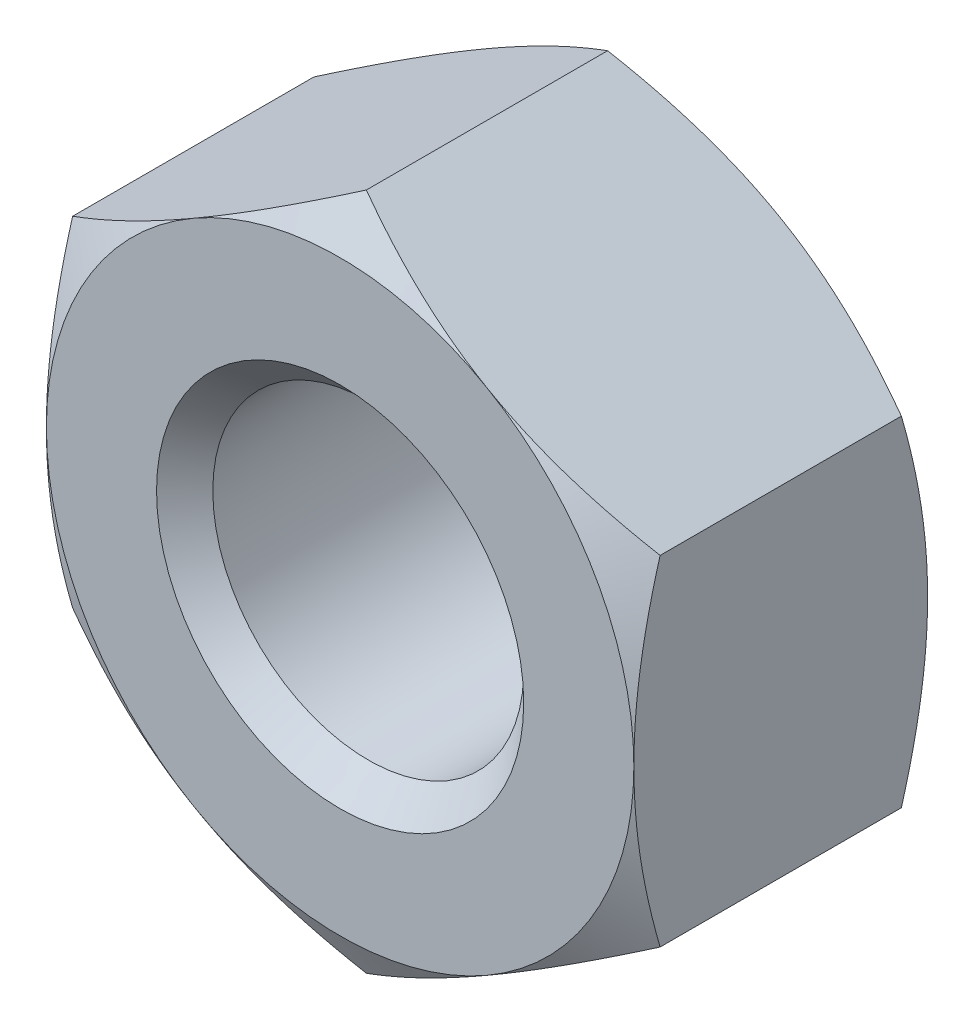
ISO-10303-21;
HEADER;
FILE_DESCRIPTION(('STEP AP214'),'2;1');
FILE_NAME('part.step','',(''),(''),'','','');
FILE_SCHEMA(('AUTOMOTIVE_DESIGN { 1 0 10303 214 1 1 1 1 }'));
ENDSEC;
DATA;
#1=APPLICATION_CONTEXT('core data for automotive mechanical design processes');
#2=APPLICATION_PROTOCOL_DEFINITION('international standard','automotive_design',2000,#1);
#3=PRODUCT_CONTEXT('',#1,'mechanical');
#4=PRODUCT('Part','Part','',(#3));
#5=PRODUCT_RELATED_PRODUCT_CATEGORY('part','',(#4));
#6=PRODUCT_DEFINITION_FORMATION('','',#4);
#7=PRODUCT_DEFINITION_CONTEXT('part definition',#1,'design');
#8=PRODUCT_DEFINITION('design','',#6,#7);
#9=PRODUCT_DEFINITION_SHAPE('','',#8);
#10=(LENGTH_UNIT() NAMED_UNIT(*) SI_UNIT(.MILLI.,.METRE.));
#11=(NAMED_UNIT(*) PLANE_ANGLE_UNIT() SI_UNIT($,.RADIAN.));
#12=(NAMED_UNIT(*) SI_UNIT($,.STERADIAN.) SOLID_ANGLE_UNIT());
#13=UNCERTAINTY_MEASURE_WITH_UNIT(LENGTH_MEASURE(1.E-05),#10,'distance_accuracy_value','');
#14=(GEOMETRIC_REPRESENTATION_CONTEXT(3) GLOBAL_UNCERTAINTY_ASSIGNED_CONTEXT((#13)) GLOBAL_UNIT_ASSIGNED_CONTEXT((#10,
#11,#12)) REPRESENTATION_CONTEXT('',''));
#15=CARTESIAN_POINT('',(0.,0.,0.));
#16=DIRECTION('',(0.,0.,1.));
#17=DIRECTION('',(1.,0.,0.));
#18=AXIS2_PLACEMENT_3D('',#15,#16,#17);
#19=CARTESIAN_POINT('',(0.,0.,-2.));
#20=DIRECTION('',(0.,0.,1.));
#21=DIRECTION('',(1.,0.,0.));
#22=AXIS2_PLACEMENT_3D('',#19,#20,#21);
#23=CONICAL_SURFACE('',#22,4.,1.0471975511966);
#24=CARTESIAN_POINT('',(0.,0.,-2.));
#25=DIRECTION('',(0.,0.,-1.));
#26=DIRECTION('',(1.,0.,0.));
#27=AXIS2_PLACEMENT_3D('',#24,#25,#26);
#28=CIRCLE('',#27,4.);
#29=CARTESIAN_POINT('',(4.,0.,-2.));
#30=VERTEX_POINT('',#29);
#31=CARTESIAN_POINT('',(2.,-3.46410161513775,-2.));
#32=VERTEX_POINT('',#31);
#33=EDGE_CURVE('E199',#30,#32,#28,.T.);
#34=ORIENTED_EDGE('',*,*,#33,.F.);
#35=CARTESIAN_POINT('',(4.,-2.30940107679301,-1.64273441008188));
#36=CARTESIAN_POINT('',(4.,-1.07179676973836,-2.));
#37=CARTESIAN_POINT('',(4.,0.,-2.));
#38=(BOUNDED_CURVE() B_SPLINE_CURVE(2,(#35,#36,#37),.UNSPECIFIED.,.F.,
.F.) B_SPLINE_CURVE_WITH_KNOTS((3,3),(-1.78462536994746,-1.30108428744166),
.UNSPECIFIED.) CURVE() GEOMETRIC_REPRESENTATION_ITEM() RATIONAL_B_SPLINE_CURVE((1.93301270188836,
2.08253175473056,2.08253175473056)) REPRESENTATION_ITEM(''));
#39=CARTESIAN_POINT('',(4.,-2.30940107675905,-1.64273441009221));
#40=VERTEX_POINT('',#39);
#41=EDGE_CURVE('E339',#40,#30,#38,.T.);
#42=ORIENTED_EDGE('',*,*,#41,.F.);
#43=CARTESIAN_POINT('',(2.,-3.46410161513775,-2.));
#44=CARTESIAN_POINT('',(2.92820323028725,-2.92820323026873,-2.));
#45=CARTESIAN_POINT('',(4.00000000002922,-2.30940107674163,-1.6427344100821));
#46=(BOUNDED_CURVE() B_SPLINE_CURVE(2,(#43,#44,#45),.UNSPECIFIED.,.F.,
.F.) B_SPLINE_CURVE_WITH_KNOTS((3,3),(-1.30108428744166,-0.817543204935995),
.UNSPECIFIED.) CURVE() GEOMETRIC_REPRESENTATION_ITEM() RATIONAL_B_SPLINE_CURVE((2.08253175473055,
2.08253175473056,1.93301270188844)) REPRESENTATION_ITEM(''));
#47=EDGE_CURVE('E159',#32,#40,#46,.T.);
#48=ORIENTED_EDGE('',*,*,#47,.F.);
#49=EDGE_LOOP('',(#34,#42,#48));
#50=FACE_BOUND('',#49,.T.);
#51=ADVANCED_FACE('F17',(#50),#23,.T.);
#52=CARTESIAN_POINT('',(0.,0.,-2.));
#53=DIRECTION('',(0.,0.,1.));
#54=DIRECTION('',(1.,0.,0.));
#55=AXIS2_PLACEMENT_3D('',#52,#53,#54);
#56=CONICAL_SURFACE('',#55,4.,1.0471975511966);
#57=CARTESIAN_POINT('',(0.,0.,-2.));
#58=DIRECTION('',(0.,0.,-1.));
#59=DIRECTION('',(1.,0.,0.));
#60=AXIS2_PLACEMENT_3D('',#57,#58,#59);
#61=CIRCLE('',#60,4.);
#62=CARTESIAN_POINT('',(-2.,-3.46410161513776,-2.));
#63=VERTEX_POINT('',#62);
#64=EDGE_CURVE('E154',#32,#63,#61,.T.);
#65=ORIENTED_EDGE('',*,*,#64,.F.);
#66=CARTESIAN_POINT('',(-2.95281200039479E-11,-4.61880215353405,-1.642734410082));
#67=CARTESIAN_POINT('',(1.07179676971262,-4.00000000000685,-2.));
#68=CARTESIAN_POINT('',(2.,-3.46410161513775,-2.));
#69=(BOUNDED_CURVE() B_SPLINE_CURVE(2,(#66,#67,#68),.UNSPECIFIED.,.F.,
.F.) B_SPLINE_CURVE_WITH_KNOTS((3,3),(-1.78462536994739,-1.30108428744166),
.UNSPECIFIED.) CURVE() GEOMETRIC_REPRESENTATION_ITEM() RATIONAL_B_SPLINE_CURVE((1.9330127018884,
2.08253175473055,2.08253175473055)) REPRESENTATION_ITEM(''));
#70=CARTESIAN_POINT('',(0.,-4.61880215351701,-1.64273441009184));
#71=VERTEX_POINT('',#70);
#72=EDGE_CURVE('E147',#71,#32,#69,.T.);
#73=ORIENTED_EDGE('',*,*,#72,.F.);
#74=CARTESIAN_POINT('',(-1.99999999999999,-3.46410161513776,-2.));
#75=CARTESIAN_POINT('',(-1.07179676971262,-4.00000000000685,-2.));
#76=CARTESIAN_POINT('',(2.95292687010294E-11,-4.61880215353405,-1.642734410082));
#77=(BOUNDED_CURVE() B_SPLINE_CURVE(2,(#74,#75,#76),.UNSPECIFIED.,.F.,
.F.) B_SPLINE_CURVE_WITH_KNOTS((3,3),(-1.30108428744166,-0.81754320493593),
.UNSPECIFIED.) CURVE() GEOMETRIC_REPRESENTATION_ITEM() RATIONAL_B_SPLINE_CURVE((2.08253175473056,
2.08253175473056,1.9330127018884)) REPRESENTATION_ITEM(''));
#78=EDGE_CURVE('E151',#63,#71,#77,.T.);
#79=ORIENTED_EDGE('',*,*,#78,.F.);
#80=EDGE_LOOP('',(#65,#73,#79));
#81=FACE_BOUND('',#80,.T.);
#82=ADVANCED_FACE('F149',(#81),#56,.T.);
#83=CARTESIAN_POINT('',(0.,0.,-2.));
#84=DIRECTION('',(0.,0.,1.));
#85=DIRECTION('',(1.,0.,0.));
#86=AXIS2_PLACEMENT_3D('',#83,#84,#85);
#87=CONICAL_SURFACE('',#86,4.,1.0471975511966);
#88=CARTESIAN_POINT('',(0.,0.,-2.));
#89=DIRECTION('',(0.,0.,-1.));
#90=DIRECTION('',(1.,0.,0.));
#91=AXIS2_PLACEMENT_3D('',#88,#89,#90);
#92=CIRCLE('',#91,4.);
#93=CARTESIAN_POINT('',(-4.,0.,-2.));
#94=VERTEX_POINT('',#93);
#95=EDGE_CURVE('E222',#63,#94,#92,.T.);
#96=ORIENTED_EDGE('',*,*,#95,.F.);
#97=CARTESIAN_POINT('',(-4.00000000002953,-2.30940107674145,-1.642734410082));
#98=CARTESIAN_POINT('',(-2.92820323028737,-2.92820323026866,-2.));
#99=CARTESIAN_POINT('',(-1.99999999999999,-3.46410161513776,-2.));
#100=(BOUNDED_CURVE() B_SPLINE_CURVE(2,(#97,#98,#99),.UNSPECIFIED.,.F.,
.F.) B_SPLINE_CURVE_WITH_KNOTS((3,3),(-1.78462536994738,-1.30108428744166),
.UNSPECIFIED.) CURVE() GEOMETRIC_REPRESENTATION_ITEM() RATIONAL_B_SPLINE_CURVE((1.9330127018884,
2.08253175473056,2.08253175473056)) REPRESENTATION_ITEM(''));
#101=CARTESIAN_POINT('',(-4.,-2.3094010767585,-1.64273441009184));
#102=VERTEX_POINT('',#101);
#103=EDGE_CURVE('E174',#102,#63,#100,.T.);
#104=ORIENTED_EDGE('',*,*,#103,.F.);
#105=CARTESIAN_POINT('',(-4.,0.,-2.));
#106=CARTESIAN_POINT('',(-4.,-1.07179676973819,-2.));
#107=CARTESIAN_POINT('',(-4.,-2.3094010767926,-1.642734410082));
#108=(BOUNDED_CURVE() B_SPLINE_CURVE(2,(#105,#106,#107),.UNSPECIFIED.,.F.,
.F.) B_SPLINE_CURVE_WITH_KNOTS((3,3),(-1.30108428744166,-0.81754320493593),
.UNSPECIFIED.) CURVE() GEOMETRIC_REPRESENTATION_ITEM() RATIONAL_B_SPLINE_CURVE((2.08253175473055,
2.08253175473055,1.9330127018884)) REPRESENTATION_ITEM(''));
#109=EDGE_CURVE('E303',#94,#102,#108,.T.);
#110=ORIENTED_EDGE('',*,*,#109,.F.);
#111=EDGE_LOOP('',(#96,#104,#110));
#112=FACE_BOUND('',#111,.T.);
#113=ADVANCED_FACE('F545',(#112),#87,.T.);
#114=CARTESIAN_POINT('',(0.,0.,-2.));
#115=DIRECTION('',(0.,0.,1.));
#116=DIRECTION('',(1.,0.,0.));
#117=AXIS2_PLACEMENT_3D('',#114,#115,#116);
#118=CONICAL_SURFACE('',#117,4.,1.0471975511966);
#119=CARTESIAN_POINT('',(0.,0.,-2.));
#120=DIRECTION('',(0.,0.,-1.));
#121=DIRECTION('',(1.,0.,0.));
#122=AXIS2_PLACEMENT_3D('',#119,#120,#121);
#123=CIRCLE('',#122,4.);
#124=CARTESIAN_POINT('',(-2.,3.46410161513775,-2.));
#125=VERTEX_POINT('',#124);
#126=EDGE_CURVE('E215',#94,#125,#123,.T.);
#127=ORIENTED_EDGE('',*,*,#126,.F.);
#128=CARTESIAN_POINT('',(-4.,2.30940107679259,-1.642734410082));
#129=CARTESIAN_POINT('',(-4.,1.07179676973819,-2.));
#130=CARTESIAN_POINT('',(-4.,0.,-2.));
#131=(BOUNDED_CURVE() B_SPLINE_CURVE(2,(#128,#129,#130),.UNSPECIFIED.,.F.,
.F.) B_SPLINE_CURVE_WITH_KNOTS((3,3),(-1.78462536994738,-1.30108428744166),
.UNSPECIFIED.) CURVE() GEOMETRIC_REPRESENTATION_ITEM() RATIONAL_B_SPLINE_CURVE((1.9330127018884,
2.08253175473055,2.08253175473055)) REPRESENTATION_ITEM(''));
#132=CARTESIAN_POINT('',(-4.,2.3094010767585,-1.64273441009184));
#133=VERTEX_POINT('',#132);
#134=EDGE_CURVE('E310',#133,#94,#131,.T.);
#135=ORIENTED_EDGE('',*,*,#134,.F.);
#136=CARTESIAN_POINT('',(-2.,3.46410161513775,-2.));
#137=CARTESIAN_POINT('',(-2.92820323028738,2.92820323026866,-2.));
#138=CARTESIAN_POINT('',(-4.00000000002952,2.30940107674146,-1.642734410082));
#139=(BOUNDED_CURVE() B_SPLINE_CURVE(2,(#136,#137,#138),.UNSPECIFIED.,.F.,
.F.) B_SPLINE_CURVE_WITH_KNOTS((3,3),(-1.30108428744166,-0.817543204935931),
.UNSPECIFIED.) CURVE() GEOMETRIC_REPRESENTATION_ITEM() RATIONAL_B_SPLINE_CURVE((2.08253175473055,
2.08253175473055,1.9330127018884)) REPRESENTATION_ITEM(''));
#140=EDGE_CURVE('E229',#125,#133,#139,.T.);
#141=ORIENTED_EDGE('',*,*,#140,.F.);
#142=EDGE_LOOP('',(#127,#135,#141));
#143=FACE_BOUND('',#142,.T.);
#144=ADVANCED_FACE('F486',(#143),#118,.T.);
#145=CARTESIAN_POINT('',(0.,0.,-2.));
#146=DIRECTION('',(0.,0.,1.));
#147=DIRECTION('',(1.,0.,0.));
#148=AXIS2_PLACEMENT_3D('',#145,#146,#147);
#149=CONICAL_SURFACE('',#148,4.,1.0471975511966);
#150=CARTESIAN_POINT('',(2.,3.46410161513775,-2.));
#151=CARTESIAN_POINT('',(1.07179676971262,4.00000000000685,-2.));
#152=CARTESIAN_POINT('',(-2.95240995641624E-11,4.61880215353405,-1.642734410082));
#153=(BOUNDED_CURVE() B_SPLINE_CURVE(2,(#150,#151,#152),.UNSPECIFIED.,.F.,
.F.) B_SPLINE_CURVE_WITH_KNOTS((3,3),(-1.30108428744166,-0.817543204935931),
.UNSPECIFIED.) CURVE() GEOMETRIC_REPRESENTATION_ITEM() RATIONAL_B_SPLINE_CURVE((2.08253175473056,
2.08253175473056,1.9330127018884)) REPRESENTATION_ITEM(''));
#154=CARTESIAN_POINT('',(2.,3.46410161513776,-2.));
#155=VERTEX_POINT('',#154);
#156=CARTESIAN_POINT('',(0.,4.61880215351701,-1.64273441009184));
#157=VERTEX_POINT('',#156);
#158=EDGE_CURVE('E266',#155,#157,#153,.T.);
#159=ORIENTED_EDGE('',*,*,#158,.F.);
#160=CARTESIAN_POINT('',(0.,0.,-2.));
#161=DIRECTION('',(0.,0.,-1.));
#162=DIRECTION('',(1.,0.,0.));
#163=AXIS2_PLACEMENT_3D('',#160,#161,#162);
#164=CIRCLE('',#163,4.);
#165=EDGE_CURVE('E200',#125,#155,#164,.T.);
#166=ORIENTED_EDGE('',*,*,#165,.F.);
#167=CARTESIAN_POINT('',(2.95212278214586E-11,4.61880215353405,-1.642734410082));
#168=CARTESIAN_POINT('',(-1.07179676971263,4.00000000000685,-2.));
#169=CARTESIAN_POINT('',(-2.,3.46410161513775,-2.));
#170=(BOUNDED_CURVE() B_SPLINE_CURVE(2,(#167,#168,#169),.UNSPECIFIED.,.F.,
.F.) B_SPLINE_CURVE_WITH_KNOTS((3,3),(-1.78462536994738,-1.30108428744166),
.UNSPECIFIED.) CURVE() GEOMETRIC_REPRESENTATION_ITEM() RATIONAL_B_SPLINE_CURVE((1.9330127018884,
2.08253175473055,2.08253175473055)) REPRESENTATION_ITEM(''));
#171=EDGE_CURVE('E235',#157,#125,#170,.T.);
#172=ORIENTED_EDGE('',*,*,#171,.F.);
#173=EDGE_LOOP('',(#159,#166,#172));
#174=FACE_BOUND('',#173,.T.);
#175=ADVANCED_FACE('F479',(#174),#149,.T.);
#176=CARTESIAN_POINT('',(0.,0.,-2.));
#177=DIRECTION('',(0.,0.,1.));
#178=DIRECTION('',(1.,0.,0.));
#179=AXIS2_PLACEMENT_3D('',#176,#177,#178);
#180=CONICAL_SURFACE('',#179,4.,1.0471975511966);
#181=CARTESIAN_POINT('',(0.,0.,-2.));
#182=DIRECTION('',(0.,0.,1.));
#183=DIRECTION('',(1.,0.,0.));
#184=AXIS2_PLACEMENT_3D('',#181,#182,#183);
#185=CIRCLE('',#184,4.);
#186=EDGE_CURVE('E192',#30,#155,#185,.T.);
#187=ORIENTED_EDGE('',*,*,#186,.T.);
#188=CARTESIAN_POINT('',(4.00000000002952,2.30940107674146,-1.642734410082));
#189=CARTESIAN_POINT('',(2.92820323028738,2.92820323026866,-2.));
#190=CARTESIAN_POINT('',(2.,3.46410161513775,-2.));
#191=(BOUNDED_CURVE() B_SPLINE_CURVE(2,(#188,#189,#190),.UNSPECIFIED.,.F.,
.F.) B_SPLINE_CURVE_WITH_KNOTS((3,3),(-1.78462536994738,-1.30108428744166),
.UNSPECIFIED.) CURVE() GEOMETRIC_REPRESENTATION_ITEM() RATIONAL_B_SPLINE_CURVE((1.9330127018884,
2.08253175473056,2.08253175473056)) REPRESENTATION_ITEM(''));
#192=CARTESIAN_POINT('',(4.,2.3094010767585,-1.64273441009184));
#193=VERTEX_POINT('',#192);
#194=EDGE_CURVE('E188',#193,#155,#191,.T.);
#195=ORIENTED_EDGE('',*,*,#194,.F.);
#196=CARTESIAN_POINT('',(4.,0.,-2.));
#197=CARTESIAN_POINT('',(4.,1.07179676973819,-2.));
#198=CARTESIAN_POINT('',(4.,2.3094010767926,-1.642734410082));
#199=(BOUNDED_CURVE() B_SPLINE_CURVE(2,(#196,#197,#198),.UNSPECIFIED.,.F.,
.F.) B_SPLINE_CURVE_WITH_KNOTS((3,3),(-1.30108428744166,-0.817543204935931),
.UNSPECIFIED.) CURVE() GEOMETRIC_REPRESENTATION_ITEM() RATIONAL_B_SPLINE_CURVE((2.08253175473056,
2.08253175473056,1.9330127018884)) REPRESENTATION_ITEM(''));
#200=EDGE_CURVE('E368',#30,#193,#199,.T.);
#201=ORIENTED_EDGE('',*,*,#200,.F.);
#202=EDGE_LOOP('',(#187,#195,#201));
#203=FACE_BOUND('',#202,.T.);
#204=ADVANCED_FACE('F560',(#203),#180,.T.);
#205=CARTESIAN_POINT('',(0.,0.,2.));
#206=DIRECTION('',(0.,0.,-1.));
#207=DIRECTION('',(1.,0.,0.));
#208=AXIS2_PLACEMENT_3D('',#205,#206,#207);
#209=CONICAL_SURFACE('',#208,4.,1.0471975511966);
#210=CARTESIAN_POINT('',(4.,0.,2.));
#211=CARTESIAN_POINT('',(4.,1.0717967697382,2.));
#212=CARTESIAN_POINT('',(4.,2.30940107679259,1.642734410082));
#213=(BOUNDED_CURVE() B_SPLINE_CURVE(2,(#210,#211,#212),.UNSPECIFIED.,.F.,
.F.) B_SPLINE_CURVE_WITH_KNOTS((3,3),(1.30108428744166,1.78462536994738),
.UNSPECIFIED.) CURVE() GEOMETRIC_REPRESENTATION_ITEM() RATIONAL_B_SPLINE_CURVE((2.08253175473056,
2.08253175473056,1.9330127018884)) REPRESENTATION_ITEM(''));
#214=CARTESIAN_POINT('',(4.,0.,2.));
#215=VERTEX_POINT('',#214);
#216=CARTESIAN_POINT('',(4.,2.3094010767585,1.64273441009184));
#217=VERTEX_POINT('',#216);
#218=EDGE_CURVE('E311',#215,#217,#213,.T.);
#219=ORIENTED_EDGE('',*,*,#218,.T.);
#220=CARTESIAN_POINT('',(4.00000000002952,2.30940107674146,1.642734410082));
#221=CARTESIAN_POINT('',(2.92820323028737,2.92820323026866,2.));
#222=CARTESIAN_POINT('',(2.,3.46410161513775,2.));
#223=(BOUNDED_CURVE() B_SPLINE_CURVE(2,(#220,#221,#222),.UNSPECIFIED.,.F.,
.F.) B_SPLINE_CURVE_WITH_KNOTS((3,3),(0.817543204935931,1.30108428744166),
.UNSPECIFIED.) CURVE() GEOMETRIC_REPRESENTATION_ITEM() RATIONAL_B_SPLINE_CURVE((1.9330127018884,
2.08253175473056,2.08253175473056)) REPRESENTATION_ITEM(''));
#224=CARTESIAN_POINT('',(2.,3.46410161513776,2.));
#225=VERTEX_POINT('',#224);
#226=EDGE_CURVE('E11',#217,#225,#223,.T.);
#227=ORIENTED_EDGE('',*,*,#226,.T.);
#228=CARTESIAN_POINT('',(0.,0.,2.));
#229=DIRECTION('',(0.,0.,1.));
#230=DIRECTION('',(1.,0.,0.));
#231=AXIS2_PLACEMENT_3D('',#228,#229,#230);
#232=CIRCLE('',#231,4.);
#233=EDGE_CURVE('E225',#215,#225,#232,.T.);
#234=ORIENTED_EDGE('',*,*,#233,.F.);
#235=EDGE_LOOP('',(#219,#227,#234));
#236=FACE_BOUND('',#235,.T.);
#237=ADVANCED_FACE('F578',(#236),#209,.T.);
#238=CARTESIAN_POINT('',(0.,0.,2.));
#239=DIRECTION('',(0.,0.,-1.));
#240=DIRECTION('',(1.,0.,0.));
#241=AXIS2_PLACEMENT_3D('',#238,#239,#240);
#242=CONICAL_SURFACE('',#241,4.,1.0471975511966);
#243=CARTESIAN_POINT('',(2.95243867384328E-11,4.61880215353405,1.642734410082));
#244=CARTESIAN_POINT('',(-1.07179676971263,4.00000000000685,2.));
#245=CARTESIAN_POINT('',(-2.,3.46410161513775,2.));
#246=(BOUNDED_CURVE() B_SPLINE_CURVE(2,(#243,#244,#245),.UNSPECIFIED.,.F.,
.F.) B_SPLINE_CURVE_WITH_KNOTS((3,3),(0.81754320493593,1.30108428744166),
.UNSPECIFIED.) CURVE() GEOMETRIC_REPRESENTATION_ITEM() RATIONAL_B_SPLINE_CURVE((1.9330127018884,
2.08253175473056,2.08253175473055)) REPRESENTATION_ITEM(''));
#247=CARTESIAN_POINT('',(0.,4.61880215351701,1.64273441009184));
#248=VERTEX_POINT('',#247);
#249=CARTESIAN_POINT('',(-2.,3.46410161513775,2.));
#250=VERTEX_POINT('',#249);
#251=EDGE_CURVE('E213',#248,#250,#246,.T.);
#252=ORIENTED_EDGE('',*,*,#251,.T.);
#253=CARTESIAN_POINT('',(0.,0.,2.));
#254=DIRECTION('',(0.,0.,1.));
#255=DIRECTION('',(1.,0.,0.));
#256=AXIS2_PLACEMENT_3D('',#253,#254,#255);
#257=CIRCLE('',#256,4.);
#258=EDGE_CURVE('E290',#225,#250,#257,.T.);
#259=ORIENTED_EDGE('',*,*,#258,.F.);
#260=CARTESIAN_POINT('',(2.,3.46410161513775,2.));
#261=CARTESIAN_POINT('',(1.07179676971262,4.00000000000685,2.));
#262=CARTESIAN_POINT('',(-2.95263969583255E-11,4.61880215353405,1.642734410082));
#263=(BOUNDED_CURVE() B_SPLINE_CURVE(2,(#260,#261,#262),.UNSPECIFIED.,.F.,
.F.) B_SPLINE_CURVE_WITH_KNOTS((3,3),(1.30108428744166,1.78462536994738),
.UNSPECIFIED.) CURVE() GEOMETRIC_REPRESENTATION_ITEM() RATIONAL_B_SPLINE_CURVE((2.08253175473056,
2.08253175473056,1.9330127018884)) REPRESENTATION_ITEM(''));
#264=EDGE_CURVE('E30',#225,#248,#263,.T.);
#265=ORIENTED_EDGE('',*,*,#264,.T.);
#266=EDGE_LOOP('',(#252,#259,#265));
#267=FACE_BOUND('',#266,.T.);
#268=ADVANCED_FACE('F572',(#267),#242,.T.);
#269=CARTESIAN_POINT('',(0.,0.,2.));
#270=DIRECTION('',(0.,0.,-1.));
#271=DIRECTION('',(1.,0.,0.));
#272=AXIS2_PLACEMENT_3D('',#269,#270,#271);
#273=CONICAL_SURFACE('',#272,4.,1.0471975511966);
#274=CARTESIAN_POINT('',(-2.,3.46410161513775,2.));
#275=CARTESIAN_POINT('',(-2.92820323028738,2.92820323026866,2.));
#276=CARTESIAN_POINT('',(-4.00000000002953,2.30940107674145,1.642734410082));
#277=(BOUNDED_CURVE() B_SPLINE_CURVE(2,(#274,#275,#276),.UNSPECIFIED.,.F.,
.F.) B_SPLINE_CURVE_WITH_KNOTS((3,3),(1.30108428744166,1.78462536994738),
.UNSPECIFIED.) CURVE() GEOMETRIC_REPRESENTATION_ITEM() RATIONAL_B_SPLINE_CURVE((2.08253175473055,
2.08253175473055,1.9330127018884)) REPRESENTATION_ITEM(''));
#278=CARTESIAN_POINT('',(-4.,2.3094010767585,1.64273441009184));
#279=VERTEX_POINT('',#278);
#280=EDGE_CURVE('E207',#250,#279,#277,.T.);
#281=ORIENTED_EDGE('',*,*,#280,.T.);
#282=CARTESIAN_POINT('',(-4.,2.3094010767926,1.642734410082));
#283=CARTESIAN_POINT('',(-4.,1.07179676973819,2.));
#284=CARTESIAN_POINT('',(-4.,0.,2.));
#285=(BOUNDED_CURVE() B_SPLINE_CURVE(2,(#282,#283,#284),.UNSPECIFIED.,.F.,
.F.) B_SPLINE_CURVE_WITH_KNOTS((3,3),(0.81754320493593,1.30108428744166),
.UNSPECIFIED.) CURVE() GEOMETRIC_REPRESENTATION_ITEM() RATIONAL_B_SPLINE_CURVE((1.9330127018884,
2.08253175473055,2.08253175473055)) REPRESENTATION_ITEM(''));
#286=CARTESIAN_POINT('',(-4.,0.,2.));
#287=VERTEX_POINT('',#286);
#288=EDGE_CURVE('E182',#279,#287,#285,.T.);
#289=ORIENTED_EDGE('',*,*,#288,.T.);
#290=CARTESIAN_POINT('',(0.,0.,2.));
#291=DIRECTION('',(0.,0.,1.));
#292=DIRECTION('',(1.,0.,0.));
#293=AXIS2_PLACEMENT_3D('',#290,#291,#292);
#294=CIRCLE('',#293,4.);
#295=EDGE_CURVE('E296',#250,#287,#294,.T.);
#296=ORIENTED_EDGE('',*,*,#295,.F.);
#297=EDGE_LOOP('',(#281,#289,#296));
#298=FACE_BOUND('',#297,.T.);
#299=ADVANCED_FACE('F577',(#298),#273,.T.);
#300=CARTESIAN_POINT('',(0.,0.,2.));
#301=DIRECTION('',(0.,0.,-1.));
#302=DIRECTION('',(1.,0.,0.));
#303=AXIS2_PLACEMENT_3D('',#300,#301,#302);
#304=CONICAL_SURFACE('',#303,4.,1.0471975511966);
#305=CARTESIAN_POINT('',(-4.,0.,2.));
#306=CARTESIAN_POINT('',(-4.,-1.07179676973819,2.));
#307=CARTESIAN_POINT('',(-4.,-2.3094010767926,1.642734410082));
#308=(BOUNDED_CURVE() B_SPLINE_CURVE(2,(#305,#306,#307),.UNSPECIFIED.,.F.,
.F.) B_SPLINE_CURVE_WITH_KNOTS((3,3),(1.30108428744166,1.78462536994738),
.UNSPECIFIED.) CURVE() GEOMETRIC_REPRESENTATION_ITEM() RATIONAL_B_SPLINE_CURVE((2.08253175473055,
2.08253175473055,1.9330127018884)) REPRESENTATION_ITEM(''));
#309=CARTESIAN_POINT('',(-4.,-2.3094010767585,1.64273441009184));
#310=VERTEX_POINT('',#309);
#311=EDGE_CURVE('E380',#287,#310,#308,.T.);
#312=ORIENTED_EDGE('',*,*,#311,.T.);
#313=CARTESIAN_POINT('',(-4.00000000002952,-2.30940107674146,1.642734410082));
#314=CARTESIAN_POINT('',(-2.92820323028737,-2.92820323026866,2.));
#315=CARTESIAN_POINT('',(-1.99999999999999,-3.46410161513776,2.));
#316=(BOUNDED_CURVE() B_SPLINE_CURVE(2,(#313,#314,#315),.UNSPECIFIED.,.F.,
.F.) B_SPLINE_CURVE_WITH_KNOTS((3,3),(0.817543204935932,1.30108428744166),
.UNSPECIFIED.) CURVE() GEOMETRIC_REPRESENTATION_ITEM() RATIONAL_B_SPLINE_CURVE((1.9330127018884,
2.08253175473056,2.08253175473056)) REPRESENTATION_ITEM(''));
#317=CARTESIAN_POINT('',(-2.,-3.46410161513776,2.));
#318=VERTEX_POINT('',#317);
#319=EDGE_CURVE('E160',#310,#318,#316,.T.);
#320=ORIENTED_EDGE('',*,*,#319,.T.);
#321=CARTESIAN_POINT('',(0.,0.,2.));
#322=DIRECTION('',(0.,0.,1.));
#323=DIRECTION('',(1.,0.,0.));
#324=AXIS2_PLACEMENT_3D('',#321,#322,#323);
#325=CIRCLE('',#324,4.);
#326=EDGE_CURVE('E206',#287,#318,#325,.T.);
#327=ORIENTED_EDGE('',*,*,#326,.F.);
#328=EDGE_LOOP('',(#312,#320,#327));
#329=FACE_BOUND('',#328,.T.);
#330=ADVANCED_FACE('F519',(#329),#304,.T.);
#331=CARTESIAN_POINT('',(0.,0.,2.));
#332=DIRECTION('',(0.,0.,-1.));
#333=DIRECTION('',(1.,0.,0.));
#334=AXIS2_PLACEMENT_3D('',#331,#332,#333);
#335=CONICAL_SURFACE('',#334,4.,1.0471975511966);
#336=CARTESIAN_POINT('',(-1.99999999999999,-3.46410161513776,2.));
#337=CARTESIAN_POINT('',(-1.07179676971262,-4.00000000000685,2.));
#338=CARTESIAN_POINT('',(2.9525248261244E-11,-4.61880215353405,1.642734410082));
#339=(BOUNDED_CURVE() B_SPLINE_CURVE(2,(#336,#337,#338),.UNSPECIFIED.,.F.,
.F.) B_SPLINE_CURVE_WITH_KNOTS((3,3),(1.30108428744166,1.78462536994738),
.UNSPECIFIED.) CURVE() GEOMETRIC_REPRESENTATION_ITEM() RATIONAL_B_SPLINE_CURVE((2.08253175473056,
2.08253175473056,1.9330127018884)) REPRESENTATION_ITEM(''));
#340=CARTESIAN_POINT('',(0.,-4.61880215351701,1.64273441009184));
#341=VERTEX_POINT('',#340);
#342=EDGE_CURVE('E21',#318,#341,#339,.T.);
#343=ORIENTED_EDGE('',*,*,#342,.T.);
#344=CARTESIAN_POINT('',(-2.95269713068663E-11,-4.61880215353405,1.642734410082));
#345=CARTESIAN_POINT('',(1.07179676971262,-4.00000000000685,2.));
#346=CARTESIAN_POINT('',(2.,-3.46410161513775,2.));
#347=(BOUNDED_CURVE() B_SPLINE_CURVE(2,(#344,#345,#346),.UNSPECIFIED.,.F.,
.F.) B_SPLINE_CURVE_WITH_KNOTS((3,3),(0.81754320493593,1.30108428744166),
.UNSPECIFIED.) CURVE() GEOMETRIC_REPRESENTATION_ITEM() RATIONAL_B_SPLINE_CURVE((1.9330127018884,
2.08253175473056,2.08253175473056)) REPRESENTATION_ITEM(''));
#348=CARTESIAN_POINT('',(2.,-3.46410161513775,2.));
#349=VERTEX_POINT('',#348);
#350=EDGE_CURVE('E166',#341,#349,#347,.T.);
#351=ORIENTED_EDGE('',*,*,#350,.T.);
#352=CARTESIAN_POINT('',(0.,0.,2.));
#353=DIRECTION('',(0.,0.,1.));
#354=DIRECTION('',(1.,0.,0.));
#355=AXIS2_PLACEMENT_3D('',#352,#353,#354);
#356=CIRCLE('',#355,4.);
#357=EDGE_CURVE('E201',#318,#349,#356,.T.);
#358=ORIENTED_EDGE('',*,*,#357,.F.);
#359=EDGE_LOOP('',(#343,#351,#358));
#360=FACE_BOUND('',#359,.T.);
#361=ADVANCED_FACE('F513',(#360),#335,.T.);
#362=CARTESIAN_POINT('',(0.,0.,2.));
#363=DIRECTION('',(0.,0.,-1.));
#364=DIRECTION('',(1.,0.,0.));
#365=AXIS2_PLACEMENT_3D('',#362,#363,#364);
#366=CONICAL_SURFACE('',#365,4.,1.0471975511966);
#367=CARTESIAN_POINT('',(2.,-3.46410161513775,2.));
#368=CARTESIAN_POINT('',(2.92820323028725,-2.92820323026873,2.));
#369=CARTESIAN_POINT('',(4.00000000002922,-2.30940107674163,1.6427344100821));
#370=(BOUNDED_CURVE() B_SPLINE_CURVE(2,(#367,#368,#369),.UNSPECIFIED.,.F.,
.F.) B_SPLINE_CURVE_WITH_KNOTS((3,3),(1.30108428744166,1.78462536994732),
.UNSPECIFIED.) CURVE() GEOMETRIC_REPRESENTATION_ITEM() RATIONAL_B_SPLINE_CURVE((2.08253175473056,
2.08253175473056,1.93301270188844)) REPRESENTATION_ITEM(''));
#371=CARTESIAN_POINT('',(4.,-2.30940107675905,1.64273441009221));
#372=VERTEX_POINT('',#371);
#373=EDGE_CURVE('E334',#349,#372,#370,.T.);
#374=ORIENTED_EDGE('',*,*,#373,.T.);
#375=CARTESIAN_POINT('',(4.,-2.309401076793,1.64273441008188));
#376=CARTESIAN_POINT('',(4.,-1.07179676973835,2.));
#377=CARTESIAN_POINT('',(4.,0.,2.));
#378=(BOUNDED_CURVE() B_SPLINE_CURVE(2,(#375,#376,#377),.UNSPECIFIED.,.F.,
.F.) B_SPLINE_CURVE_WITH_KNOTS((3,3),(0.817543204935857,1.30108428744166),
.UNSPECIFIED.) CURVE() GEOMETRIC_REPRESENTATION_ITEM() RATIONAL_B_SPLINE_CURVE((1.93301270188836,
2.08253175473056,2.08253175473056)) REPRESENTATION_ITEM(''));
#379=EDGE_CURVE('E262',#372,#215,#378,.T.);
#380=ORIENTED_EDGE('',*,*,#379,.T.);
#381=CARTESIAN_POINT('',(0.,0.,2.));
#382=DIRECTION('',(0.,0.,1.));
#383=DIRECTION('',(1.,0.,0.));
#384=AXIS2_PLACEMENT_3D('',#381,#382,#383);
#385=CIRCLE('',#384,4.);
#386=EDGE_CURVE('E205',#349,#215,#385,.T.);
#387=ORIENTED_EDGE('',*,*,#386,.F.);
#388=EDGE_LOOP('',(#374,#380,#387));
#389=FACE_BOUND('',#388,.T.);
#390=ADVANCED_FACE('F518',(#389),#366,.T.);
#391=CARTESIAN_POINT('',(4.,2.3094010767585,2.));
#392=DIRECTION('',(-0.5,-0.866025403784439,0.));
#393=DIRECTION('',(-0.866025403784439,0.5,0.));
#394=AXIS2_PLACEMENT_3D('',#391,#392,#393);
#395=PLANE('',#394);
#396=DIRECTION('',(0.,0.,-1.));
#397=VECTOR('',#396,1.);
#398=CARTESIAN_POINT('',(4.,2.3094010767585,2.));
#399=LINE('',#398,#397);
#400=EDGE_CURVE('E319',#217,#193,#399,.T.);
#401=ORIENTED_EDGE('',*,*,#400,.T.);
#402=ORIENTED_EDGE('',*,*,#194,.T.);
#403=ORIENTED_EDGE('',*,*,#158,.T.);
#404=DIRECTION('',(0.,0.,-1.));
#405=VECTOR('',#404,1.);
#406=CARTESIAN_POINT('',(0.,4.61880215351701,2.));
#407=LINE('',#406,#405);
#408=EDGE_CURVE('E298',#248,#157,#407,.T.);
#409=ORIENTED_EDGE('',*,*,#408,.F.);
#410=ORIENTED_EDGE('',*,*,#264,.F.);
#411=ORIENTED_EDGE('',*,*,#226,.F.);
#412=EDGE_LOOP('',(#401,#402,#403,#409,#410,#411));
#413=FACE_BOUND('',#412,.T.);
#414=ADVANCED_FACE('F597',(#413),#395,.F.);
#415=CARTESIAN_POINT('',(4.,-2.3094010767585,2.));
#416=DIRECTION('',(-1.,0.,0.));
#417=DIRECTION('',(0.,1.,0.));
#418=AXIS2_PLACEMENT_3D('',#415,#416,#417);
#419=PLANE('',#418);
#420=DIRECTION('',(0.,0.,-1.));
#421=VECTOR('',#420,1.);
#422=CARTESIAN_POINT('',(4.,-2.3094010767585,2.));
#423=LINE('',#422,#421);
#424=EDGE_CURVE('E330',#372,#40,#423,.T.);
#425=ORIENTED_EDGE('',*,*,#424,.T.);
#426=ORIENTED_EDGE('',*,*,#41,.T.);
#427=ORIENTED_EDGE('',*,*,#200,.T.);
#428=ORIENTED_EDGE('',*,*,#400,.F.);
#429=ORIENTED_EDGE('',*,*,#218,.F.);
#430=ORIENTED_EDGE('',*,*,#379,.F.);
#431=EDGE_LOOP('',(#425,#426,#427,#428,#429,#430));
#432=FACE_BOUND('',#431,.T.);
#433=ADVANCED_FACE('F620',(#432),#419,.F.);
#434=CARTESIAN_POINT('',(0.,-4.61880215351701,2.));
#435=DIRECTION('',(-0.5,0.866025403784439,0.));
#436=DIRECTION('',(0.,0.,1.));
#437=AXIS2_PLACEMENT_3D('',#434,#435,#436);
#438=PLANE('',#437);
#439=DIRECTION('',(0.,0.,-1.));
#440=VECTOR('',#439,1.);
#441=CARTESIAN_POINT('',(0.,-4.61880215351701,2.));
#442=LINE('',#441,#440);
#443=EDGE_CURVE('E163',#341,#71,#442,.T.);
#444=ORIENTED_EDGE('',*,*,#443,.T.);
#445=ORIENTED_EDGE('',*,*,#72,.T.);
#446=ORIENTED_EDGE('',*,*,#47,.T.);
#447=ORIENTED_EDGE('',*,*,#424,.F.);
#448=ORIENTED_EDGE('',*,*,#373,.F.);
#449=ORIENTED_EDGE('',*,*,#350,.F.);
#450=EDGE_LOOP('',(#444,#445,#446,#447,#448,#449));
#451=FACE_BOUND('',#450,.T.);
#452=ADVANCED_FACE('F164',(#451),#438,.F.);
#453=CARTESIAN_POINT('',(-4.,-2.3094010767585,2.));
#454=DIRECTION('',(0.5,0.866025403784439,0.));
#455=DIRECTION('',(0.,0.,-1.));
#456=AXIS2_PLACEMENT_3D('',#453,#454,#455);
#457=PLANE('',#456);
#458=DIRECTION('',(0.,0.,-1.));
#459=VECTOR('',#458,1.);
#460=CARTESIAN_POINT('',(-4.,-2.3094010767585,2.));
#461=LINE('',#460,#459);
#462=EDGE_CURVE('E309',#310,#102,#461,.T.);
#463=ORIENTED_EDGE('',*,*,#462,.T.);
#464=ORIENTED_EDGE('',*,*,#103,.T.);
#465=ORIENTED_EDGE('',*,*,#78,.T.);
#466=ORIENTED_EDGE('',*,*,#443,.F.);
#467=ORIENTED_EDGE('',*,*,#342,.F.);
#468=ORIENTED_EDGE('',*,*,#319,.F.);
#469=EDGE_LOOP('',(#463,#464,#465,#466,#467,#468));
#470=FACE_BOUND('',#469,.T.);
#471=ADVANCED_FACE('F173',(#470),#457,.F.);
#472=CARTESIAN_POINT('',(-4.,2.3094010767585,2.));
#473=DIRECTION('',(1.,0.,0.));
#474=DIRECTION('',(0.,1.,0.));
#475=AXIS2_PLACEMENT_3D('',#472,#473,#474);
#476=PLANE('',#475);
#477=DIRECTION('',(0.,0.,-1.));
#478=VECTOR('',#477,1.);
#479=CARTESIAN_POINT('',(-4.,2.3094010767585,2.));
#480=LINE('',#479,#478);
#481=EDGE_CURVE('E214',#279,#133,#480,.T.);
#482=ORIENTED_EDGE('',*,*,#481,.T.);
#483=ORIENTED_EDGE('',*,*,#134,.T.);
#484=ORIENTED_EDGE('',*,*,#109,.T.);
#485=ORIENTED_EDGE('',*,*,#462,.F.);
#486=ORIENTED_EDGE('',*,*,#311,.F.);
#487=ORIENTED_EDGE('',*,*,#288,.F.);
#488=EDGE_LOOP('',(#482,#483,#484,#485,#486,#487));
#489=FACE_BOUND('',#488,.T.);
#490=ADVANCED_FACE('F488',(#489),#476,.F.);
#491=CARTESIAN_POINT('',(0.,4.61880215351701,2.));
#492=DIRECTION('',(0.5,-0.866025403784439,0.));
#493=DIRECTION('',(0.,0.,-1.));
#494=AXIS2_PLACEMENT_3D('',#491,#492,#493);
#495=PLANE('',#494);
#496=ORIENTED_EDGE('',*,*,#408,.T.);
#497=ORIENTED_EDGE('',*,*,#171,.T.);
#498=ORIENTED_EDGE('',*,*,#140,.T.);
#499=ORIENTED_EDGE('',*,*,#481,.F.);
#500=ORIENTED_EDGE('',*,*,#280,.F.);
#501=ORIENTED_EDGE('',*,*,#251,.F.);
#502=EDGE_LOOP('',(#496,#497,#498,#499,#500,#501));
#503=FACE_BOUND('',#502,.T.);
#504=ADVANCED_FACE('F473',(#503),#495,.F.);
#505=CARTESIAN_POINT('',(0.,0.,-2.));
#506=DIRECTION('',(0.,0.,1.));
#507=DIRECTION('',(1.,0.,0.));
#508=AXIS2_PLACEMENT_3D('',#505,#506,#507);
#509=CYLINDRICAL_SURFACE('',#508,2.117);
#510=CARTESIAN_POINT('',(0.,0.,-1.617));
#511=DIRECTION('',(0.,0.,-1.));
#512=DIRECTION('',(1.,0.,0.));
#513=AXIS2_PLACEMENT_3D('',#510,#511,#512);
#514=CIRCLE('',#513,2.117);
#515=CARTESIAN_POINT('',(-2.117,0.,-1.617));
#516=VERTEX_POINT('',#515);
#517=CARTESIAN_POINT('',(0.,2.117,-1.617));
#518=VERTEX_POINT('',#517);
#519=EDGE_CURVE('E283',#516,#518,#514,.T.);
#520=ORIENTED_EDGE('',*,*,#519,.T.);
#521=CARTESIAN_POINT('',(0.,0.,-1.617));
#522=DIRECTION('',(0.,0.,-1.));
#523=DIRECTION('',(1.,0.,0.));
#524=AXIS2_PLACEMENT_3D('',#521,#522,#523);
#525=CIRCLE('',#524,2.117);
#526=EDGE_CURVE('E297',#518,#516,#525,.T.);
#527=ORIENTED_EDGE('',*,*,#526,.T.);
#528=DIRECTION('',(0.,0.,1.));
#529=VECTOR('',#528,1.);
#530=CARTESIAN_POINT('',(-2.117,0.,-2.));
#531=LINE('',#530,#529);
#532=CARTESIAN_POINT('',(-2.117,0.,1.617));
#533=VERTEX_POINT('',#532);
#534=EDGE_CURVE('E302',#516,#533,#531,.T.);
#535=ORIENTED_EDGE('',*,*,#534,.T.);
#536=CARTESIAN_POINT('',(0.,0.,1.617));
#537=DIRECTION('',(0.,0.,1.));
#538=DIRECTION('',(1.,0.,0.));
#539=AXIS2_PLACEMENT_3D('',#536,#537,#538);
#540=CIRCLE('',#539,2.117);
#541=CARTESIAN_POINT('',(0.,2.117,1.617));
#542=VERTEX_POINT('',#541);
#543=EDGE_CURVE('E242',#533,#542,#540,.T.);
#544=ORIENTED_EDGE('',*,*,#543,.T.);
#545=CARTESIAN_POINT('',(0.,0.,1.617));
#546=DIRECTION('',(0.,0.,1.));
#547=DIRECTION('',(1.,0.,0.));
#548=AXIS2_PLACEMENT_3D('',#545,#546,#547);
#549=CIRCLE('',#548,2.117);
#550=EDGE_CURVE('E245',#542,#533,#549,.T.);
#551=ORIENTED_EDGE('',*,*,#550,.T.);
#552=ORIENTED_EDGE('',*,*,#534,.F.);
#553=EDGE_LOOP('',(#520,#527,#535,#544,#551,#552));
#554=FACE_BOUND('',#553,.T.);
#555=ADVANCED_FACE('F19',(#554),#509,.F.);
#556=CARTESIAN_POINT('',(-4.,2.3094010767585,-2.));
#557=DIRECTION('',(0.,0.,1.));
#558=DIRECTION('',(1.,0.,0.));
#559=AXIS2_PLACEMENT_3D('',#556,#557,#558);
#560=PLANE('',#559);
#561=CARTESIAN_POINT('',(0.,0.,-2.));
#562=DIRECTION('',(0.,0.,1.));
#563=DIRECTION('',(0.,-1.,0.));
#564=AXIS2_PLACEMENT_3D('',#561,#562,#563);
#565=CIRCLE('',#564,2.5);
#566=CARTESIAN_POINT('',(0.,2.5,-2.));
#567=VERTEX_POINT('',#566);
#568=EDGE_CURVE('E284',#567,#567,#565,.T.);
#569=ORIENTED_EDGE('',*,*,#568,.T.);
#570=EDGE_LOOP('',(#569));
#571=FACE_BOUND('',#570,.T.);
#572=ORIENTED_EDGE('',*,*,#64,.T.);
#573=ORIENTED_EDGE('',*,*,#95,.T.);
#574=ORIENTED_EDGE('',*,*,#126,.T.);
#575=ORIENTED_EDGE('',*,*,#165,.T.);
#576=ORIENTED_EDGE('',*,*,#186,.F.);
#577=ORIENTED_EDGE('',*,*,#33,.T.);
#578=EDGE_LOOP('',(#572,#573,#574,#575,#576,#577));
#579=FACE_BOUND('',#578,.T.);
#580=ADVANCED_FACE('F484',(#571,#579),#560,.F.);
#581=CARTESIAN_POINT('',(-4.,2.3094010767585,2.));
#582=DIRECTION('',(0.,0.,1.));
#583=DIRECTION('',(1.,0.,0.));
#584=AXIS2_PLACEMENT_3D('',#581,#582,#583);
#585=PLANE('',#584);
#586=CARTESIAN_POINT('',(0.,0.,2.));
#587=DIRECTION('',(0.,0.,-1.));
#588=DIRECTION('',(0.,-1.,0.));
#589=AXIS2_PLACEMENT_3D('',#586,#587,#588);
#590=CIRCLE('',#589,2.5);
#591=CARTESIAN_POINT('',(0.,2.5,2.));
#592=VERTEX_POINT('',#591);
#593=EDGE_CURVE('E320',#592,#592,#590,.T.);
#594=ORIENTED_EDGE('',*,*,#593,.T.);
#595=EDGE_LOOP('',(#594));
#596=FACE_BOUND('',#595,.T.);
#597=ORIENTED_EDGE('',*,*,#258,.T.);
#598=ORIENTED_EDGE('',*,*,#295,.T.);
#599=ORIENTED_EDGE('',*,*,#326,.T.);
#600=ORIENTED_EDGE('',*,*,#357,.T.);
#601=ORIENTED_EDGE('',*,*,#386,.T.);
#602=ORIENTED_EDGE('',*,*,#233,.T.);
#603=EDGE_LOOP('',(#597,#598,#599,#600,#601,#602));
#604=FACE_BOUND('',#603,.T.);
#605=ADVANCED_FACE('F531',(#596,#604),#585,.T.);
#606=CARTESIAN_POINT('',(0.,0.,-1.74019237886467));
#607=DIRECTION('',(0.,0.,-1.));
#608=DIRECTION('',(0.,-1.,0.));
#609=AXIS2_PLACEMENT_3D('',#606,#607,#608);
#610=CONICAL_SURFACE('',#609,2.24019237886467,0.78539816339745);
#611=ORIENTED_EDGE('',*,*,#568,.F.);
#612=DIRECTION('',(0.,-0.707106781186549,0.707106781186546));
#613=VECTOR('',#612,1.);
#614=CARTESIAN_POINT('',(0.,2.24019237886467,-1.74019237886467));
#615=LINE('',#614,#613);
#616=EDGE_CURVE('E276',#567,#518,#615,.T.);
#617=ORIENTED_EDGE('',*,*,#616,.T.);
#618=ORIENTED_EDGE('',*,*,#519,.F.);
#619=ORIENTED_EDGE('',*,*,#526,.F.);
#620=ORIENTED_EDGE('',*,*,#616,.F.);
#621=EDGE_LOOP('',(#611,#617,#618,#619,#620));
#622=FACE_BOUND('',#621,.T.);
#623=ADVANCED_FACE('F525',(#622),#610,.F.);
#624=CARTESIAN_POINT('',(0.,0.,1.74019237886467));
#625=DIRECTION('',(0.,0.,1.));
#626=DIRECTION('',(0.,-1.,0.));
#627=AXIS2_PLACEMENT_3D('',#624,#625,#626);
#628=CONICAL_SURFACE('',#627,2.24019237886467,0.78539816339745);
#629=ORIENTED_EDGE('',*,*,#543,.F.);
#630=ORIENTED_EDGE('',*,*,#550,.F.);
#631=DIRECTION('',(0.,0.707106781186549,0.707106781186546));
#632=VECTOR('',#631,1.);
#633=CARTESIAN_POINT('',(0.,2.24019237886467,1.74019237886467));
#634=LINE('',#633,#632);
#635=EDGE_CURVE('E326',#542,#592,#634,.T.);
#636=ORIENTED_EDGE('',*,*,#635,.T.);
#637=ORIENTED_EDGE('',*,*,#593,.F.);
#638=ORIENTED_EDGE('',*,*,#635,.F.);
#639=EDGE_LOOP('',(#629,#630,#636,#637,#638));
#640=FACE_BOUND('',#639,.T.);
#641=ADVANCED_FACE('F530',(#640),#628,.F.);
#642=CLOSED_SHELL('',(#51,#82,#113,#144,#175,#204,#237,#268,#299,#330,#361,#390,#414,#433,#452,
#471,#490,#504,#555,#580,#605,#623,#641));
#643=MANIFOLD_SOLID_BREP('B1',#642);
#644=ADVANCED_BREP_SHAPE_REPRESENTATION('',(#18,#643),#14);
#645=SHAPE_DEFINITION_REPRESENTATION(#9,#644);
ENDSEC;
END-ISO-10303-21;
